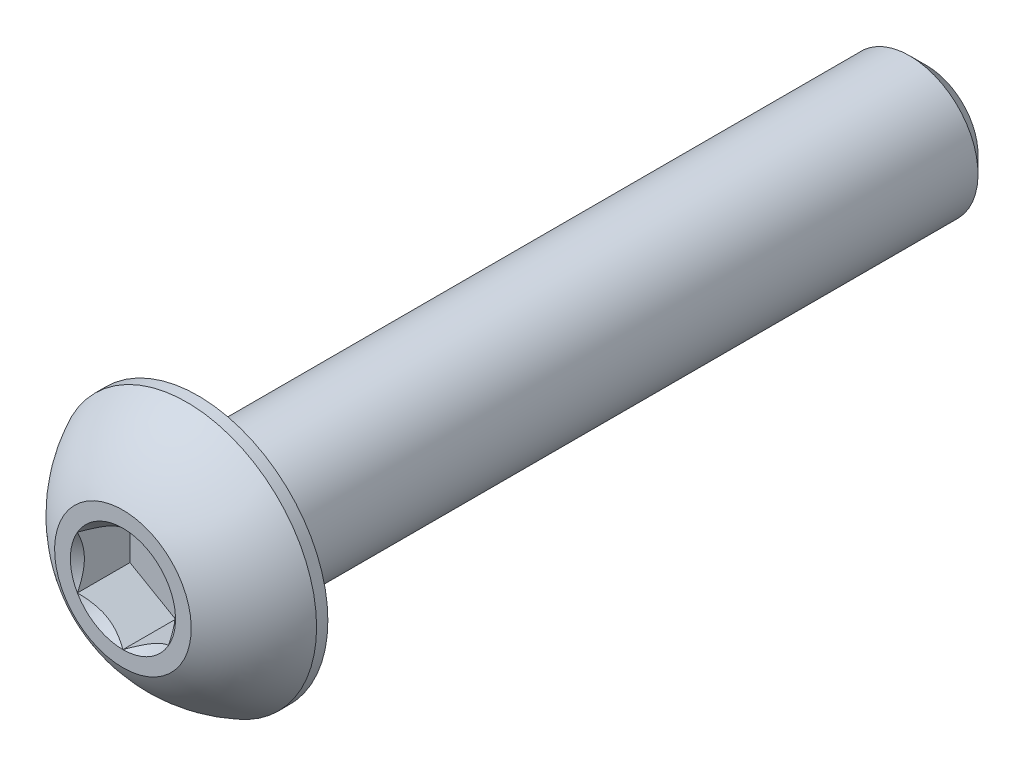
ISO-10303-21;
HEADER;
FILE_DESCRIPTION(('STEP AP214'),'2;1');
FILE_NAME('part.step','',(''),(''),'','','');
FILE_SCHEMA(('AUTOMOTIVE_DESIGN { 1 0 10303 214 1 1 1 1 }'));
ENDSEC;
DATA;
#1=APPLICATION_CONTEXT('core data for automotive mechanical design processes');
#2=APPLICATION_PROTOCOL_DEFINITION('international standard','automotive_design',2000,#1);
#3=PRODUCT_CONTEXT('',#1,'mechanical');
#4=PRODUCT('Part','Part','',(#3));
#5=PRODUCT_RELATED_PRODUCT_CATEGORY('part','',(#4));
#6=PRODUCT_DEFINITION_FORMATION('','',#4);
#7=PRODUCT_DEFINITION_CONTEXT('part definition',#1,'design');
#8=PRODUCT_DEFINITION('design','',#6,#7);
#9=PRODUCT_DEFINITION_SHAPE('','',#8);
#10=(LENGTH_UNIT() NAMED_UNIT(*) SI_UNIT(.MILLI.,.METRE.));
#11=(NAMED_UNIT(*) PLANE_ANGLE_UNIT() SI_UNIT($,.RADIAN.));
#12=(NAMED_UNIT(*) SI_UNIT($,.STERADIAN.) SOLID_ANGLE_UNIT());
#13=UNCERTAINTY_MEASURE_WITH_UNIT(LENGTH_MEASURE(1.E-05),#10,'distance_accuracy_value','');
#14=(GEOMETRIC_REPRESENTATION_CONTEXT(3) GLOBAL_UNCERTAINTY_ASSIGNED_CONTEXT((#13)) GLOBAL_UNIT_ASSIGNED_CONTEXT((#10,
#11,#12)) REPRESENTATION_CONTEXT('',''));
#15=CARTESIAN_POINT('',(0.,0.,0.));
#16=DIRECTION('',(0.,0.,1.));
#17=DIRECTION('',(1.,0.,0.));
#18=AXIS2_PLACEMENT_3D('',#15,#16,#17);
#19=CARTESIAN_POINT('',(-2.86,-2.85,-1.65));
#20=DIRECTION('',(0.,0.,-1.));
#21=DIRECTION('',(0.,1.,0.));
#22=AXIS2_PLACEMENT_3D('',#19,#20,#21);
#23=PLANE('',#22);
#24=CARTESIAN_POINT('',(0.,0.,-1.65));
#25=DIRECTION('',(0.,0.,1.));
#26=DIRECTION('',(1.,0.,0.));
#27=AXIS2_PLACEMENT_3D('',#24,#25,#26);
#28=CIRCLE('',#27,2.85);
#29=CARTESIAN_POINT('',(2.85,0.,-1.65));
#30=VERTEX_POINT('',#29);
#31=EDGE_CURVE('E369',#30,#30,#28,.T.);
#32=ORIENTED_EDGE('',*,*,#31,.F.);
#33=EDGE_LOOP('',(#32));
#34=FACE_BOUND('',#33,.T.);
#35=ADVANCED_FACE('F43',(#34),#23,.T.);
#36=CARTESIAN_POINT('',(1.,-0.577350269189626,-1.155));
#37=DIRECTION('',(0.,0.,1.));
#38=DIRECTION('',(1.,0.,0.));
#39=AXIS2_PLACEMENT_3D('',#36,#37,#38);
#40=PLANE('',#39);
#41=DIRECTION('',(0.866025403784438,0.5,0.));
#42=VECTOR('',#41,1.);
#43=CARTESIAN_POINT('',(0.,-1.15470053837925,-1.155));
#44=LINE('',#43,#42);
#45=CARTESIAN_POINT('',(0.,-1.15470053837925,-1.155));
#46=VERTEX_POINT('',#45);
#47=CARTESIAN_POINT('',(1.,-0.577350269189626,-1.155));
#48=VERTEX_POINT('',#47);
#49=EDGE_CURVE('E109',#46,#48,#44,.T.);
#50=ORIENTED_EDGE('',*,*,#49,.T.);
#51=DIRECTION('',(0.,1.,0.));
#52=VECTOR('',#51,1.);
#53=CARTESIAN_POINT('',(1.,-0.577350269189626,-1.155));
#54=LINE('',#53,#52);
#55=CARTESIAN_POINT('',(1.,0.577350269189626,-1.155));
#56=VERTEX_POINT('',#55);
#57=EDGE_CURVE('E166',#48,#56,#54,.T.);
#58=ORIENTED_EDGE('',*,*,#57,.T.);
#59=DIRECTION('',(-0.866025403784439,0.5,0.));
#60=VECTOR('',#59,1.);
#61=CARTESIAN_POINT('',(1.,0.577350269189626,-1.155));
#62=LINE('',#61,#60);
#63=CARTESIAN_POINT('',(0.,1.15470053837925,-1.155));
#64=VERTEX_POINT('',#63);
#65=EDGE_CURVE('E146',#56,#64,#62,.T.);
#66=ORIENTED_EDGE('',*,*,#65,.T.);
#67=DIRECTION('',(-0.866025403784438,-0.5,0.));
#68=VECTOR('',#67,1.);
#69=CARTESIAN_POINT('',(0.,1.15470053837925,-1.155));
#70=LINE('',#69,#68);
#71=CARTESIAN_POINT('',(-1.,0.577350269189626,-1.155));
#72=VERTEX_POINT('',#71);
#73=EDGE_CURVE('E162',#64,#72,#70,.T.);
#74=ORIENTED_EDGE('',*,*,#73,.T.);
#75=DIRECTION('',(0.,-1.,0.));
#76=VECTOR('',#75,1.);
#77=CARTESIAN_POINT('',(-1.,0.577350269189626,-1.155));
#78=LINE('',#77,#76);
#79=CARTESIAN_POINT('',(-1.,-0.577350269189626,-1.155));
#80=VERTEX_POINT('',#79);
#81=EDGE_CURVE('E159',#72,#80,#78,.T.);
#82=ORIENTED_EDGE('',*,*,#81,.T.);
#83=DIRECTION('',(0.866025403784439,-0.5,0.));
#84=VECTOR('',#83,1.);
#85=CARTESIAN_POINT('',(-1.,-0.577350269189626,-1.155));
#86=LINE('',#85,#84);
#87=EDGE_CURVE('E150',#80,#46,#86,.T.);
#88=ORIENTED_EDGE('',*,*,#87,.T.);
#89=EDGE_LOOP('',(#50,#58,#66,#74,#82,#88));
#90=FACE_BOUND('',#89,.T.);
#91=ADVANCED_FACE('F185',(#90),#40,.T.);
#92=CARTESIAN_POINT('',(-1.,-0.577350269189626,-1.155));
#93=DIRECTION('',(-0.5,-0.866025403784439,0.));
#94=DIRECTION('',(0.866025403784439,-0.5,0.));
#95=AXIS2_PLACEMENT_3D('',#92,#93,#94);
#96=PLANE('',#95);
#97=DIRECTION('',(0.,0.,1.));
#98=VECTOR('',#97,1.);
#99=CARTESIAN_POINT('',(-1.,-0.577350269189626,-1.155));
#100=LINE('',#99,#98);
#101=CARTESIAN_POINT('',(-1.,-0.577350269189626,0.));
#102=VERTEX_POINT('',#101);
#103=EDGE_CURVE('E116',#80,#102,#100,.T.);
#104=ORIENTED_EDGE('',*,*,#103,.T.);
#105=CARTESIAN_POINT('',(-1.0002,-0.577234799135788,0.000115487372614006));
#106=CARTESIAN_POINT('',(-0.965817404992819,-0.597085599618622,-0.0197220691742671));
#107=CARTESIAN_POINT('',(-0.930859881860175,-0.617268335009457,-0.0383949793611112));
#108=CARTESIAN_POINT('',(-0.859577197043911,-0.658423412276686,-0.072585257276842));
#109=CARTESIAN_POINT('',(-0.823245249471016,-0.67939967198808,-0.0880835909765412));
#110=CARTESIAN_POINT('',(-0.749983386196689,-0.721697428470847,-0.114632692857735));
#111=CARTESIAN_POINT('',(-0.713072148554586,-0.743008141459637,-0.125750226003074));
#112=CARTESIAN_POINT('',(-0.638437270689141,-0.786098608286186,-0.142880134223818));
#113=CARTESIAN_POINT('',(-0.600715911891365,-0.807877044942281,-0.148905302533327));
#114=CARTESIAN_POINT('',(-0.535707801582067,-0.845409494928863,-0.154339445032506));
#115=CARTESIAN_POINT('',(-0.508505628471828,-0.861114676896602,-0.155143061683268));
#116=CARTESIAN_POINT('',(-0.454153959330888,-0.892494627706029,-0.153793300583113));
#117=CARTESIAN_POINT('',(-0.427004476245125,-0.908169389073954,-0.151639270452801));
#118=CARTESIAN_POINT('',(-0.34594372267304,-0.954969836969511,-0.140883027871529));
#119=CARTESIAN_POINT('',(-0.292435859021573,-0.985862616452447,-0.127985443584644));
#120=CARTESIAN_POINT('',(-0.198523934856569,-1.04008269114923,-0.0968592693978226));
#121=CARTESIAN_POINT('',(-0.157679476328166,-1.06366425027551,-0.0802622022981606));
#122=CARTESIAN_POINT('',(-0.0775903626180563,-1.1099037216352,-0.0428750753147073));
#123=CARTESIAN_POINT('',(-0.0383409891295622,-1.1325643579843,-0.0220986581825968));
#124=CARTESIAN_POINT('',(0.000199999999999995,-1.15481600843309,0.000115487372613952));
#125=B_SPLINE_CURVE_WITH_KNOTS('',3,(#105,#106,#107,#108,#109,#110,#111,#112,#113,#114,#115,
#116,#117,#118,#119,#120,#121,#122,#123,#124),.UNSPECIFIED.,.F.,.F.,(4,2,2,2,2,2,2,2,2,4),(0.,
0.133237676828559,0.26725222983449,0.3991370762693,0.530689603280768,0.624814864263846,
0.718960890149132,0.907306626112097,1.05710100361789,1.20641411519286),.UNSPECIFIED.);
#126=CARTESIAN_POINT('',(0.,-1.15470053837925,0.));
#127=VERTEX_POINT('',#126);
#128=EDGE_CURVE('E101',#102,#127,#125,.T.);
#129=ORIENTED_EDGE('',*,*,#128,.T.);
#130=DIRECTION('',(0.,0.,1.));
#131=VECTOR('',#130,1.);
#132=CARTESIAN_POINT('',(0.,-1.15470053837925,-1.155));
#133=LINE('',#132,#131);
#134=EDGE_CURVE('E115',#46,#127,#133,.T.);
#135=ORIENTED_EDGE('',*,*,#134,.F.);
#136=ORIENTED_EDGE('',*,*,#87,.F.);
#137=EDGE_LOOP('',(#104,#129,#135,#136));
#138=FACE_BOUND('',#137,.T.);
#139=ADVANCED_FACE('F113',(#138),#96,.F.);
#140=CARTESIAN_POINT('',(0.,-1.15470053837925,-1.155));
#141=DIRECTION('',(0.5,-0.866025403784438,0.));
#142=DIRECTION('',(0.866025403784438,0.5,0.));
#143=AXIS2_PLACEMENT_3D('',#140,#141,#142);
#144=PLANE('',#143);
#145=ORIENTED_EDGE('',*,*,#134,.T.);
#146=CARTESIAN_POINT('',(-0.000200000000000057,-1.15481600843309,0.000115487372614094));
#147=CARTESIAN_POINT('',(0.0341825950071806,-1.13496520795026,-0.019722069174267));
#148=CARTESIAN_POINT('',(0.0691401181398248,-1.11478247255942,-0.0383949793611112));
#149=CARTESIAN_POINT('',(0.14042280295609,-1.07362739529219,-0.0725852572768421));
#150=CARTESIAN_POINT('',(0.176754750528984,-1.0526511355808,-0.0880835909765414));
#151=CARTESIAN_POINT('',(0.250016613803311,-1.01035337909803,-0.114632692857735));
#152=CARTESIAN_POINT('',(0.286927851445414,-0.989042666109241,-0.125750226003074));
#153=CARTESIAN_POINT('',(0.361562729310859,-0.945952199282691,-0.142880134223818));
#154=CARTESIAN_POINT('',(0.399284088108636,-0.924173762626596,-0.148905302533327));
#155=CARTESIAN_POINT('',(0.464292198417934,-0.886641312640014,-0.154339445032507));
#156=CARTESIAN_POINT('',(0.491494371528173,-0.870936130672275,-0.155143061683268));
#157=CARTESIAN_POINT('',(0.545846040669112,-0.839556179862848,-0.153793300583113));
#158=CARTESIAN_POINT('',(0.572995523754876,-0.823881418494923,-0.151639270452801));
#159=CARTESIAN_POINT('',(0.65405627732696,-0.777080970599366,-0.140883027871529));
#160=CARTESIAN_POINT('',(0.707564140978428,-0.74618819111643,-0.127985443584644));
#161=CARTESIAN_POINT('',(0.801476065143432,-0.691968116419649,-0.0968592693978231));
#162=CARTESIAN_POINT('',(0.842320523671834,-0.668386557293371,-0.080262202298161));
#163=CARTESIAN_POINT('',(0.922409637381944,-0.622147085933681,-0.0428750753147077));
#164=CARTESIAN_POINT('',(0.961659010870438,-0.599486449584575,-0.0220986581825972));
#165=CARTESIAN_POINT('',(1.0002,-0.577234799135788,0.000115487372613412));
#166=B_SPLINE_CURVE_WITH_KNOTS('',3,(#146,#147,#148,#149,#150,#151,#152,#153,#154,#155,#156,
#157,#158,#159,#160,#161,#162,#163,#164,#165),.UNSPECIFIED.,.F.,.F.,(4,2,2,2,2,2,2,2,2,4),(0.,
0.133237676828559,0.26725222983449,0.399137076269301,0.530689603280769,0.624814864263847,
0.718960890149134,0.907306626112098,1.05710100361789,1.20641411519286),.UNSPECIFIED.);
#167=CARTESIAN_POINT('',(1.,-0.577350269189626,0.));
#168=VERTEX_POINT('',#167);
#169=EDGE_CURVE('E106',#127,#168,#166,.T.);
#170=ORIENTED_EDGE('',*,*,#169,.T.);
#171=DIRECTION('',(0.,0.,1.));
#172=VECTOR('',#171,1.);
#173=CARTESIAN_POINT('',(1.,-0.577350269189626,-1.155));
#174=LINE('',#173,#172);
#175=EDGE_CURVE('E64',#48,#168,#174,.T.);
#176=ORIENTED_EDGE('',*,*,#175,.F.);
#177=ORIENTED_EDGE('',*,*,#49,.F.);
#178=EDGE_LOOP('',(#145,#170,#176,#177));
#179=FACE_BOUND('',#178,.T.);
#180=ADVANCED_FACE('F119',(#179),#144,.F.);
#181=CARTESIAN_POINT('',(1.,-0.577350269189626,-1.155));
#182=DIRECTION('',(1.,0.,0.));
#183=DIRECTION('',(0.,0.,-1.));
#184=AXIS2_PLACEMENT_3D('',#181,#182,#183);
#185=PLANE('',#184);
#186=ORIENTED_EDGE('',*,*,#175,.T.);
#187=CARTESIAN_POINT('',(1.,-1.15147208646462,0.370385677513861));
#188=CARTESIAN_POINT('',(1.,-1.12343447988552,0.349219919873711));
#189=CARTESIAN_POINT('',(1.,-1.09524064850697,0.328261692175909));
#190=CARTESIAN_POINT('',(1.,-1.03847715644376,0.286846022235621));
#191=CARTESIAN_POINT('',(1.,-1.00990740382975,0.266388706123658));
#192=CARTESIAN_POINT('',(1.,-0.923120894333477,0.205604794954508));
#193=CARTESIAN_POINT('',(1.,-0.864253173759059,0.166192228961397));
#194=CARTESIAN_POINT('',(1.,-0.740809858258045,0.0888206642002043));
#195=CARTESIAN_POINT('',(1.,-0.676100255137807,0.0510730391143415));
#196=CARTESIAN_POINT('',(1.,-0.543448939049124,-0.0179754124487089));
#197=CARTESIAN_POINT('',(1.,-0.475519112027779,-0.0492979721531354));
#198=CARTESIAN_POINT('',(1.,-0.373555850333529,-0.0876182211162059));
#199=CARTESIAN_POINT('',(1.,-0.341031989670907,-0.0986164083578445));
#200=CARTESIAN_POINT('',(1.,-0.275199079052293,-0.11800165785264));
#201=CARTESIAN_POINT('',(1.,-0.241889975173933,-0.126388540223302));
#202=CARTESIAN_POINT('',(1.,-0.175247517042992,-0.139974779280984));
#203=CARTESIAN_POINT('',(1.,-0.141925568218175,-0.145229209232033));
#204=CARTESIAN_POINT('',(1.,-0.0749144362322789,-0.152451313429109));
#205=CARTESIAN_POINT('',(1.,-0.0412251978501617,-0.154418486389493));
#206=CARTESIAN_POINT('',(1.,0.0249580992634211,-0.15491680160684));
#207=CARTESIAN_POINT('',(1.,0.0574512826460394,-0.153569732111366));
#208=CARTESIAN_POINT('',(1.,0.122148505701867,-0.147783515501016));
#209=CARTESIAN_POINT('',(1.,0.154352610132927,-0.143345079338465));
#210=CARTESIAN_POINT('',(1.,0.21879989886764,-0.131543169854797));
#211=CARTESIAN_POINT('',(1.,0.251033743268954,-0.124129458961492));
#212=CARTESIAN_POINT('',(1.,0.314797132354919,-0.106771057501325));
#213=CARTESIAN_POINT('',(1.,0.346326735731005,-0.096826578711171));
#214=CARTESIAN_POINT('',(1.,0.445594187730205,-0.061776517445664));
#215=CARTESIAN_POINT('',(1.,0.511919139476036,-0.0326791416432762));
#216=CARTESIAN_POINT('',(1.,0.641453244657532,0.032015329686504));
#217=CARTESIAN_POINT('',(1.,0.704650133126344,0.0676357767152409));
#218=CARTESIAN_POINT('',(1.,0.825428490174987,0.141123901346934));
#219=CARTESIAN_POINT('',(1.,0.883132947867685,0.178791947135462));
#220=CARTESIAN_POINT('',(1.,0.968148853704565,0.237022852943162));
#221=CARTESIAN_POINT('',(1.,0.996120570380285,0.256638475762855));
#222=CARTESIAN_POINT('',(1.,1.05168177729901,0.29638851706127));
#223=CARTESIAN_POINT('',(1.,1.079271369977,0.316522792198831));
#224=CARTESIAN_POINT('',(1.,1.10670185346329,0.336872119072971));
#225=B_SPLINE_CURVE_WITH_KNOTS('',3,(#187,#188,#189,#190,#191,#192,#193,#194,#195,#196,#197,
#198,#199,#200,#201,#202,#203,#204,#205,#206,#207,#208,#209,#210,#211,#212,#213,#214,#215,#216,
#217,#218,#219,#220,#221,#222,#223,#224),.UNSPECIFIED.,.F.,.F.,(4,2,2,2,2,2,2,2,2,2,2,2,2,2,2,2,
2,2,4),(0.,0.105386459083291,0.210799187330125,0.423233611565469,0.647793540908503,
0.87158087773861,0.974493074181421,1.07741235827201,1.17846428203205,1.27953161415762,
1.3769408673961,1.47432772585408,1.57343322804293,1.67253043972851,1.88917353996827,
2.10660791038813,2.31323734249843,2.41572589232045,2.51818641476503),.UNSPECIFIED.);
#226=CARTESIAN_POINT('',(1.,0.577350269189626,0.));
#227=VERTEX_POINT('',#226);
#228=EDGE_CURVE('E132',#168,#227,#225,.T.);
#229=ORIENTED_EDGE('',*,*,#228,.T.);
#230=DIRECTION('',(0.,0.,1.));
#231=VECTOR('',#230,1.);
#232=CARTESIAN_POINT('',(1.,0.577350269189626,-1.155));
#233=LINE('',#232,#231);
#234=EDGE_CURVE('E136',#56,#227,#233,.T.);
#235=ORIENTED_EDGE('',*,*,#234,.F.);
#236=ORIENTED_EDGE('',*,*,#57,.F.);
#237=EDGE_LOOP('',(#186,#229,#235,#236));
#238=FACE_BOUND('',#237,.T.);
#239=ADVANCED_FACE('F135',(#238),#185,.F.);
#240=CARTESIAN_POINT('',(1.,0.577350269189626,-1.155));
#241=DIRECTION('',(0.5,0.866025403784439,0.));
#242=DIRECTION('',(-0.866025403784439,0.5,0.));
#243=AXIS2_PLACEMENT_3D('',#240,#241,#242);
#244=PLANE('',#243);
#245=ORIENTED_EDGE('',*,*,#234,.T.);
#246=CARTESIAN_POINT('',(1.0002,0.577234799135788,0.00011548737261379));
#247=CARTESIAN_POINT('',(0.965817404992819,0.597085599618622,-0.0197220691742671));
#248=CARTESIAN_POINT('',(0.930859881860175,0.617268335009456,-0.0383949793611112));
#249=CARTESIAN_POINT('',(0.85957719704391,0.658423412276686,-0.0725852572768423));
#250=CARTESIAN_POINT('',(0.823245249471016,0.67939967198808,-0.0880835909765417));
#251=CARTESIAN_POINT('',(0.749983386196689,0.721697428470847,-0.114632692857735));
#252=CARTESIAN_POINT('',(0.713072148554586,0.743008141459637,-0.125750226003074));
#253=CARTESIAN_POINT('',(0.638437270689141,0.786098608286186,-0.142880134223818));
#254=CARTESIAN_POINT('',(0.600715911891364,0.807877044942281,-0.148905302533328));
#255=CARTESIAN_POINT('',(0.535707801582067,0.845409494928863,-0.154339445032507));
#256=CARTESIAN_POINT('',(0.508505628471828,0.861114676896602,-0.155143061683268));
#257=CARTESIAN_POINT('',(0.454153959330888,0.892494627706029,-0.153793300583113));
#258=CARTESIAN_POINT('',(0.427004476245124,0.908169389073954,-0.151639270452801));
#259=CARTESIAN_POINT('',(0.34594372267304,0.954969836969511,-0.140883027871529));
#260=CARTESIAN_POINT('',(0.292435859021573,0.985862616452447,-0.127985443584644));
#261=CARTESIAN_POINT('',(0.198523934856568,1.04008269114923,-0.0968592693978228));
#262=CARTESIAN_POINT('',(0.157679476328165,1.06366425027551,-0.0802622022981607));
#263=CARTESIAN_POINT('',(0.0775903626180559,1.1099037216352,-0.0428750753147073));
#264=CARTESIAN_POINT('',(0.0383409891295617,1.1325643579843,-0.0220986581825967));
#265=CARTESIAN_POINT('',(-0.000200000000000544,1.15481600843309,0.000115487372614062));
#266=B_SPLINE_CURVE_WITH_KNOTS('',3,(#246,#247,#248,#249,#250,#251,#252,#253,#254,#255,#256,
#257,#258,#259,#260,#261,#262,#263,#264,#265),.UNSPECIFIED.,.F.,.F.,(4,2,2,2,2,2,2,2,2,4),(0.,
0.133237676828559,0.26725222983449,0.3991370762693,0.530689603280768,0.624814864263846,
0.718960890149133,0.907306626112097,1.05710100361789,1.20641411519286),.UNSPECIFIED.);
#267=CARTESIAN_POINT('',(0.,1.15470053837925,0.));
#268=VERTEX_POINT('',#267);
#269=EDGE_CURVE('E143',#227,#268,#266,.T.);
#270=ORIENTED_EDGE('',*,*,#269,.T.);
#271=DIRECTION('',(0.,0.,1.));
#272=VECTOR('',#271,1.);
#273=CARTESIAN_POINT('',(0.,1.15470053837925,-1.155));
#274=LINE('',#273,#272);
#275=EDGE_CURVE('E148',#64,#268,#274,.T.);
#276=ORIENTED_EDGE('',*,*,#275,.F.);
#277=ORIENTED_EDGE('',*,*,#65,.F.);
#278=EDGE_LOOP('',(#245,#270,#276,#277));
#279=FACE_BOUND('',#278,.T.);
#280=ADVANCED_FACE('F142',(#279),#244,.F.);
#281=CARTESIAN_POINT('',(0.,1.15470053837925,-1.155));
#282=DIRECTION('',(-0.5,0.866025403784439,0.));
#283=DIRECTION('',(-0.866025403784439,-0.5,0.));
#284=AXIS2_PLACEMENT_3D('',#281,#282,#283);
#285=PLANE('',#284);
#286=ORIENTED_EDGE('',*,*,#275,.T.);
#287=CARTESIAN_POINT('',(0.000199999999999519,1.15481600843309,0.000115487372613877));
#288=CARTESIAN_POINT('',(-0.0341825950071811,1.13496520795026,-0.0197220691742673));
#289=CARTESIAN_POINT('',(-0.0691401181398252,1.11478247255942,-0.0383949793611114));
#290=CARTESIAN_POINT('',(-0.14042280295609,1.07362739529219,-0.0725852572768421));
#291=CARTESIAN_POINT('',(-0.176754750528985,1.0526511355808,-0.0880835909765413));
#292=CARTESIAN_POINT('',(-0.250016613803312,1.01035337909803,-0.114632692857735));
#293=CARTESIAN_POINT('',(-0.286927851445415,0.989042666109241,-0.125750226003074));
#294=CARTESIAN_POINT('',(-0.361562729310859,0.945952199282691,-0.142880134223818));
#295=CARTESIAN_POINT('',(-0.399284088108636,0.924173762626597,-0.148905302533328));
#296=CARTESIAN_POINT('',(-0.464292198417934,0.886641312640015,-0.154339445032506));
#297=CARTESIAN_POINT('',(-0.491494371528172,0.870936130672276,-0.155143061683268));
#298=CARTESIAN_POINT('',(-0.545846040669112,0.839556179862849,-0.153793300583113));
#299=CARTESIAN_POINT('',(-0.572995523754876,0.823881418494924,-0.151639270452801));
#300=CARTESIAN_POINT('',(-0.65405627732696,0.777080970599367,-0.140883027871529));
#301=CARTESIAN_POINT('',(-0.707564140978428,0.74618819111643,-0.127985443584644));
#302=CARTESIAN_POINT('',(-0.801476065143432,0.69196811641965,-0.0968592693978229));
#303=CARTESIAN_POINT('',(-0.842320523671834,0.668386557293372,-0.0802622022981609));
#304=CARTESIAN_POINT('',(-0.922409637381944,0.622147085933681,-0.0428750753147075));
#305=CARTESIAN_POINT('',(-0.961659010870438,0.599486449584575,-0.022098658182597));
#306=CARTESIAN_POINT('',(-1.0002,0.577234799135788,0.000115487372613569));
#307=B_SPLINE_CURVE_WITH_KNOTS('',3,(#287,#288,#289,#290,#291,#292,#293,#294,#295,#296,#297,
#298,#299,#300,#301,#302,#303,#304,#305,#306),.UNSPECIFIED.,.F.,.F.,(4,2,2,2,2,2,2,2,2,4),(0.,
0.133237676828559,0.26725222983449,0.3991370762693,0.530689603280768,0.624814864263846,
0.718960890149133,0.907306626112097,1.05710100361789,1.20641411519286),.UNSPECIFIED.);
#308=CARTESIAN_POINT('',(-1.,0.577350269189626,0.));
#309=VERTEX_POINT('',#308);
#310=EDGE_CURVE('E202',#268,#309,#307,.T.);
#311=ORIENTED_EDGE('',*,*,#310,.T.);
#312=DIRECTION('',(0.,0.,1.));
#313=VECTOR('',#312,1.);
#314=CARTESIAN_POINT('',(-1.,0.577350269189626,-1.155));
#315=LINE('',#314,#313);
#316=EDGE_CURVE('E152',#72,#309,#315,.T.);
#317=ORIENTED_EDGE('',*,*,#316,.F.);
#318=ORIENTED_EDGE('',*,*,#73,.F.);
#319=EDGE_LOOP('',(#286,#311,#317,#318));
#320=FACE_BOUND('',#319,.T.);
#321=ADVANCED_FACE('F216',(#320),#285,.F.);
#322=CARTESIAN_POINT('',(-1.,0.577350269189626,-1.155));
#323=DIRECTION('',(-1.,0.,0.));
#324=DIRECTION('',(0.,0.,1.));
#325=AXIS2_PLACEMENT_3D('',#322,#323,#324);
#326=PLANE('',#325);
#327=ORIENTED_EDGE('',*,*,#316,.T.);
#328=CARTESIAN_POINT('',(-1.,-1.15147208646462,0.370385677513862));
#329=CARTESIAN_POINT('',(-1.,-1.12343447988552,0.349219919873712));
#330=CARTESIAN_POINT('',(-1.,-1.09524064850697,0.32826169217591));
#331=CARTESIAN_POINT('',(-1.,-1.03847715644376,0.286846022235621));
#332=CARTESIAN_POINT('',(-1.,-1.00990740382975,0.266388706123658));
#333=CARTESIAN_POINT('',(-1.,-0.923120894333477,0.205604794954509));
#334=CARTESIAN_POINT('',(-1.,-0.86425317375906,0.166192228961397));
#335=CARTESIAN_POINT('',(-1.,-0.740809858258046,0.0888206642002046));
#336=CARTESIAN_POINT('',(-1.,-0.676100255137807,0.0510730391143418));
#337=CARTESIAN_POINT('',(-1.,-0.543448939049125,-0.0179754124487087));
#338=CARTESIAN_POINT('',(-1.,-0.475519112027779,-0.0492979721531352));
#339=CARTESIAN_POINT('',(-1.,-0.373555850333529,-0.0876182211162056));
#340=CARTESIAN_POINT('',(-1.,-0.341031989670908,-0.0986164083578442));
#341=CARTESIAN_POINT('',(-1.,-0.275199079052293,-0.11800165785264));
#342=CARTESIAN_POINT('',(-1.,-0.241889975173933,-0.126388540223301));
#343=CARTESIAN_POINT('',(-1.,-0.175247517042993,-0.139974779280984));
#344=CARTESIAN_POINT('',(-1.,-0.141925568218175,-0.145229209232033));
#345=CARTESIAN_POINT('',(-1.,-0.0749144362322791,-0.152451313429108));
#346=CARTESIAN_POINT('',(-1.,-0.0412251978501619,-0.154418486389493));
#347=CARTESIAN_POINT('',(-1.,0.0249580992634209,-0.15491680160684));
#348=CARTESIAN_POINT('',(-1.,0.0574512826460392,-0.153569732111367));
#349=CARTESIAN_POINT('',(-1.,0.122148505701867,-0.147783515501016));
#350=CARTESIAN_POINT('',(-1.,0.154352610132926,-0.143345079338465));
#351=CARTESIAN_POINT('',(-1.,0.21879989886764,-0.131543169854797));
#352=CARTESIAN_POINT('',(-1.,0.251033743268954,-0.124129458961492));
#353=CARTESIAN_POINT('',(-1.,0.314797132354919,-0.106771057501325));
#354=CARTESIAN_POINT('',(-1.,0.346326735731004,-0.0968265787111711));
#355=CARTESIAN_POINT('',(-1.,0.445594187730205,-0.0617765174456643));
#356=CARTESIAN_POINT('',(-1.,0.511919139476036,-0.0326791416432766));
#357=CARTESIAN_POINT('',(-1.,0.641453244657532,0.0320153296865037));
#358=CARTESIAN_POINT('',(-1.,0.704650133126344,0.0676357767152406));
#359=CARTESIAN_POINT('',(-1.,0.825428490174986,0.141123901346934));
#360=CARTESIAN_POINT('',(-1.,0.883132947867684,0.178791947135462));
#361=CARTESIAN_POINT('',(-1.,0.968148853704565,0.237022852943162));
#362=CARTESIAN_POINT('',(-1.,0.996120570380285,0.256638475762855));
#363=CARTESIAN_POINT('',(-1.,1.05168177729901,0.29638851706127));
#364=CARTESIAN_POINT('',(-1.,1.079271369977,0.316522792198831));
#365=CARTESIAN_POINT('',(-1.,1.10670185346329,0.33687211907297));
#366=B_SPLINE_CURVE_WITH_KNOTS('',3,(#328,#329,#330,#331,#332,#333,#334,#335,#336,#337,#338,
#339,#340,#341,#342,#343,#344,#345,#346,#347,#348,#349,#350,#351,#352,#353,#354,#355,#356,#357,
#358,#359,#360,#361,#362,#363,#364,#365),.UNSPECIFIED.,.F.,.F.,(4,2,2,2,2,2,2,2,2,2,2,2,2,2,2,2,
2,2,4),(0.,0.105386459083291,0.210799187330125,0.423233611565469,0.647793540908504,
0.87158087773861,0.974493074181421,1.07741235827201,1.17846428203205,1.27953161415762,
1.3769408673961,1.47432772585408,1.57343322804293,1.67253043972851,1.88917353996827,
2.10660791038813,2.31323734249843,2.41572589232045,2.51818641476503),.UNSPECIFIED.);
#367=EDGE_CURVE('E117',#309,#102,#366,.F.);
#368=ORIENTED_EDGE('',*,*,#367,.T.);
#369=ORIENTED_EDGE('',*,*,#103,.F.);
#370=ORIENTED_EDGE('',*,*,#81,.F.);
#371=EDGE_LOOP('',(#327,#368,#369,#370));
#372=FACE_BOUND('',#371,.T.);
#373=ADVANCED_FACE('F213',(#372),#326,.F.);
#374=CARTESIAN_POINT('',(0.,0.,0.));
#375=DIRECTION('',(0.,0.,1.));
#376=DIRECTION('',(1.,0.,0.));
#377=AXIS2_PLACEMENT_3D('',#374,#375,#376);
#378=CONICAL_SURFACE('',#377,1.15470053837925,0.78539816339745);
#379=CARTESIAN_POINT('',(0.,0.,0.));
#380=DIRECTION('',(0.,0.,1.));
#381=DIRECTION('',(1.,0.,0.));
#382=AXIS2_PLACEMENT_3D('',#379,#380,#381);
#383=CIRCLE('',#382,1.15470053837925);
#384=EDGE_CURVE('E98',#102,#127,#383,.T.);
#385=ORIENTED_EDGE('',*,*,#384,.T.);
#386=ORIENTED_EDGE('',*,*,#128,.F.);
#387=EDGE_LOOP('',(#385,#386));
#388=FACE_BOUND('',#387,.T.);
#389=ADVANCED_FACE('F99',(#388),#378,.F.);
#390=EDGE_CURVE('E51',#127,#168,#383,.T.);
#391=ORIENTED_EDGE('',*,*,#390,.T.);
#392=ORIENTED_EDGE('',*,*,#169,.F.);
#393=EDGE_LOOP('',(#391,#392));
#394=FACE_BOUND('',#393,.T.);
#395=ADVANCED_FACE('F107',(#394),#378,.F.);
#396=EDGE_CURVE('E12',#168,#227,#383,.T.);
#397=ORIENTED_EDGE('',*,*,#396,.T.);
#398=ORIENTED_EDGE('',*,*,#228,.F.);
#399=EDGE_LOOP('',(#397,#398));
#400=FACE_BOUND('',#399,.T.);
#401=ADVANCED_FACE('F131',(#400),#378,.F.);
#402=EDGE_CURVE('E46',#227,#268,#383,.T.);
#403=ORIENTED_EDGE('',*,*,#402,.T.);
#404=ORIENTED_EDGE('',*,*,#269,.F.);
#405=EDGE_LOOP('',(#403,#404));
#406=FACE_BOUND('',#405,.T.);
#407=ADVANCED_FACE('F315',(#406),#378,.F.);
#408=EDGE_CURVE('E240',#268,#309,#383,.T.);
#409=ORIENTED_EDGE('',*,*,#408,.T.);
#410=ORIENTED_EDGE('',*,*,#310,.F.);
#411=EDGE_LOOP('',(#409,#410));
#412=FACE_BOUND('',#411,.T.);
#413=ADVANCED_FACE('F241',(#412),#378,.F.);
#414=EDGE_CURVE('E105',#309,#102,#383,.T.);
#415=ORIENTED_EDGE('',*,*,#414,.T.);
#416=ORIENTED_EDGE('',*,*,#367,.F.);
#417=EDGE_LOOP('',(#415,#416));
#418=FACE_BOUND('',#417,.T.);
#419=ADVANCED_FACE('F237',(#418),#378,.F.);
#420=CARTESIAN_POINT('',(0.,-1.5,0.));
#421=DIRECTION('',(0.,0.,-1.));
#422=DIRECTION('',(-1.,0.,0.));
#423=AXIS2_PLACEMENT_3D('',#420,#421,#422);
#424=PLANE('',#423);
#425=ORIENTED_EDGE('',*,*,#414,.F.);
#426=ORIENTED_EDGE('',*,*,#408,.F.);
#427=ORIENTED_EDGE('',*,*,#402,.F.);
#428=ORIENTED_EDGE('',*,*,#396,.F.);
#429=ORIENTED_EDGE('',*,*,#390,.F.);
#430=ORIENTED_EDGE('',*,*,#384,.F.);
#431=EDGE_LOOP('',(#425,#426,#427,#428,#429,#430));
#432=FACE_BOUND('',#431,.T.);
#433=CARTESIAN_POINT('',(0.,0.,0.));
#434=DIRECTION('',(0.,0.,1.));
#435=DIRECTION('',(1.,0.,0.));
#436=AXIS2_PLACEMENT_3D('',#433,#434,#435);
#437=CIRCLE('',#436,1.5);
#438=CARTESIAN_POINT('',(0.,-1.5,0.));
#439=VERTEX_POINT('',#438);
#440=EDGE_CURVE('E138',#439,#439,#437,.T.);
#441=ORIENTED_EDGE('',*,*,#440,.T.);
#442=EDGE_LOOP('',(#441));
#443=FACE_BOUND('',#442,.T.);
#444=ADVANCED_FACE('F125',(#432,#443),#424,.F.);
#445=CARTESIAN_POINT('',(0.,0.,-2.79483288770053));
#446=DIRECTION('',(0.,0.,1.));
#447=DIRECTION('',(0.,-1.,0.));
#448=AXIS2_PLACEMENT_3D('',#445,#446,#447);
#449=SPHERICAL_SURFACE('',#448,3.17192226735973);
#450=CARTESIAN_POINT('',(0.,0.,-1.4025));
#451=DIRECTION('',(0.,0.,1.));
#452=DIRECTION('',(1.,0.,0.));
#453=AXIS2_PLACEMENT_3D('',#450,#451,#452);
#454=CIRCLE('',#453,2.85);
#455=CARTESIAN_POINT('',(0.,-2.85,-1.4025));
#456=VERTEX_POINT('',#455);
#457=EDGE_CURVE('E122',#456,#456,#454,.T.);
#458=CARTESIAN_POINT('',(0.,-1.5,0.));
#459=CARTESIAN_POINT('',(0.,-1.5181600798921,-0.00974656947336491));
#460=CARTESIAN_POINT('',(0.,-1.53622513742981,-0.0196701847238471));
#461=CARTESIAN_POINT('',(0.,-1.57215840256594,-0.0398676311293115));
#462=CARTESIAN_POINT('',(0.,-1.59002661016438,-0.0501414622842937));
#463=CARTESIAN_POINT('',(0.,-1.6255593701915,-0.0710354648490232));
#464=CARTESIAN_POINT('',(0.,-1.64322392262019,-0.0816556362587706));
#465=CARTESIAN_POINT('',(0.,-1.67834266450262,-0.103238276426967));
#466=CARTESIAN_POINT('',(0.,-1.69579685395635,-0.114200745185415));
#467=CARTESIAN_POINT('',(0.,-1.73048823664554,-0.136463816635605));
#468=CARTESIAN_POINT('',(0.,-1.74772542988099,-0.147764419327346));
#469=CARTESIAN_POINT('',(0.,-1.78197627078176,-0.170699464187152));
#470=CARTESIAN_POINT('',(0.,-1.79898991844709,-0.182333906355218));
#471=CARTESIAN_POINT('',(0.,-1.83278720341135,-0.205932209546912));
#472=CARTESIAN_POINT('',(0.,-1.84957084071028,-0.217896070570539));
#473=CARTESIAN_POINT('',(0.,-1.88290172764636,-0.242148665498754));
#474=CARTESIAN_POINT('',(0.,-1.8994489772835,-0.25443739940334));
#475=CARTESIAN_POINT('',(0.,-1.93230080139369,-0.279335070725423));
#476=CARTESIAN_POINT('',(0.,-1.94860537586673,-0.291944008142919));
#477=CARTESIAN_POINT('',(0.,-1.98096565436365,-0.317477295441111));
#478=CARTESIAN_POINT('',(0.,-1.99702135838753,-0.330401645321806));
#479=CARTESIAN_POINT('',(0.,-2.02887779526296,-0.356560846652225));
#480=CARTESIAN_POINT('',(0.,-2.04467852811452,-0.369795698101948));
#481=CARTESIAN_POINT('',(0.,-2.07601901880464,-0.396570873693306));
#482=CARTESIAN_POINT('',(0.,-2.09155877664321,-0.410111197834942));
#483=CARTESIAN_POINT('',(0.,-2.12237141262985,-0.437492173862105));
#484=CARTESIAN_POINT('',(0.,-2.13764429077792,-0.451332825747632));
#485=CARTESIAN_POINT('',(0.,-2.16791736411296,-0.479309198198267));
#486=CARTESIAN_POINT('',(0.,-2.18291755929993,-0.493444918763374));
#487=CARTESIAN_POINT('',(0.,-2.21263956705415,-0.52200605739095));
#488=CARTESIAN_POINT('',(0.,-2.22736137962139,-0.536431475453418));
#489=CARTESIAN_POINT('',(0.,-2.2565210282552,-0.56556652781647));
#490=CARTESIAN_POINT('',(0.,-2.27095886432177,-0.580276162117054));
#491=CARTESIAN_POINT('',(0.,-2.2995450739765,-0.609974057702794));
#492=CARTESIAN_POINT('',(0.,-2.31369344756465,-0.62496231898795));
#493=CARTESIAN_POINT('',(0.,-2.34169535627252,-0.655211773418758));
#494=CARTESIAN_POINT('',(0.,-2.35554889139223,-0.670472966564409));
#495=CARTESIAN_POINT('',(0.,-2.38295585920366,-0.701262485885582));
#496=CARTESIAN_POINT('',(0.,-2.39650929189537,-0.716790812061104));
#497=CARTESIAN_POINT('',(0.,-2.42331090492182,-0.748108697108241));
#498=CARTESIAN_POINT('',(0.,-2.43655908525656,-0.763898255979857));
#499=CARTESIAN_POINT('',(0.,-2.46274515962755,-0.795732606824226));
#500=CARTESIAN_POINT('',(0.,-2.47568305366379,-0.811777398796979));
#501=CARTESIAN_POINT('',(0.,-2.5012436393965,-0.844116119267125));
#502=CARTESIAN_POINT('',(0.,-2.51386633109298,-0.860410047764518));
#503=CARTESIAN_POINT('',(0.,-2.53879171587278,-0.893240850042598));
#504=CARTESIAN_POINT('',(0.,-2.55109440895612,-0.909777723823285));
#505=CARTESIAN_POINT('',(0.,-2.57537512182785,-0.943088133113638));
#506=CARTESIAN_POINT('',(0.,-2.58735314161625,-0.959861668623304));
#507=CARTESIAN_POINT('',(0.,-2.61097995657956,-0.993639027894246));
#508=CARTESIAN_POINT('',(0.,-2.62262875175448,-1.01064285165552));
#509=CARTESIAN_POINT('',(0.,-2.64559269128199,-1.04487432644225));
#510=CARTESIAN_POINT('',(0.,-2.65690783563458,-1.06210197746771));
#511=CARTESIAN_POINT('',(0.,-2.67920017403639,-1.09677456077299));
#512=CARTESIAN_POINT('',(0.,-2.69017736808561,-1.11421949305282));
#513=CARTESIAN_POINT('',(0.,-2.711789634999,-1.14932001019995));
#514=CARTESIAN_POINT('',(0.,-2.72242470786316,-1.16697559506725));
#515=CARTESIAN_POINT('',(0.,-2.74334869082117,-1.20249070903943));
#516=CARTESIAN_POINT('',(0.,-2.75363760091502,-1.22035023814429));
#517=CARTESIAN_POINT('',(0.,-2.77386535089241,-1.25626645340824));
#518=CARTESIAN_POINT('',(0.,-2.78380419077596,-1.27432313956732));
#519=CARTESIAN_POINT('',(0.,-2.80332801615778,-1.31062681184411));
#520=CARTESIAN_POINT('',(0.,-2.81291300165605,-1.32887379796182));
#521=CARTESIAN_POINT('',(0.,-2.83172550494215,-1.3655511220839));
#522=CARTESIAN_POINT('',(0.,-2.84095302272998,-1.38398146008827));
#523=CARTESIAN_POINT('',(0.,-2.85,-1.4025));
#524=B_SPLINE_CURVE_WITH_KNOTS('',3,(#458,#459,#460,#461,#462,#463,#464,#465,#466,#467,#468,
#469,#470,#471,#472,#473,#474,#475,#476,#477,#478,#479,#480,#481,#482,#483,#484,#485,#486,#487,
#488,#489,#490,#491,#492,#493,#494,#495,#496,#497,#498,#499,#500,#501,#502,#503,#504,#505,#506,
#507,#508,#509,#510,#511,#512,#513,#514,#515,#516,#517,#518,#519,#520,#521,#522,#523),
.UNSPECIFIED.,.F.,.F.,(4,2,2,2,2,2,2,2,2,2,2,2,2,2,2,2,2,2,2,2,2,2,2,2,2,2,2,2,2,2,2,2,4),(0.,
0.0618298941826981,0.123659788365397,0.185489682548094,0.247319576730793,0.309149470913491,
0.37097936509619,0.432809259278888,0.494639153461587,0.556469047644284,0.618298941826983,
0.680128836009681,0.741958730192379,0.803788624375077,0.865618518557776,0.927448412740474,
0.989278306923172,1.05110820110587,1.11293809528857,1.17476798947127,1.23659788365397,
1.29842777783666,1.36025767201936,1.42208756620206,1.48391746038476,1.54574735456746,
1.60757724875015,1.66940714293285,1.73123703711555,1.79306693129825,1.85489682548095,
1.91672671966365,1.97855661384634),.UNSPECIFIED.);
#525=EDGE_CURVE('BSEAM286',#439,#456,#524,.T.);
#526=ORIENTED_EDGE('',*,*,#440,.F.);
#527=ORIENTED_EDGE('',*,*,#457,.T.);
#528=ORIENTED_EDGE('',*,*,#525,.T.);
#529=ORIENTED_EDGE('',*,*,#525,.F.);
#530=EDGE_LOOP('',(#526,#528,#527,#529));
#531=FACE_BOUND('',#530,.T.);
#532=ADVANCED_FACE('F286',(#531),#449,.T.);
#533=CARTESIAN_POINT('',(0.,0.,0.));
#534=DIRECTION('',(0.,0.,1.));
#535=DIRECTION('',(1.,0.,0.));
#536=AXIS2_PLACEMENT_3D('',#533,#534,#535);
#537=CYLINDRICAL_SURFACE('',#536,2.85);
#538=ORIENTED_EDGE('',*,*,#457,.F.);
#539=EDGE_LOOP('',(#538));
#540=FACE_BOUND('',#539,.T.);
#541=ORIENTED_EDGE('',*,*,#31,.T.);
#542=EDGE_LOOP('',(#541));
#543=FACE_BOUND('',#542,.T.);
#544=ADVANCED_FACE('F230',(#540,#543),#537,.T.);
#545=CLOSED_SHELL('',(#35,#91,#139,#180,#239,#280,#321,#373,#389,#395,#401,#407,#413,#419,#444,
#532,#544));
#546=MANIFOLD_SOLID_BREP('B2',#545);
#547=CARTESIAN_POINT('',(-2.86,-2.85,-1.65));
#548=DIRECTION('',(0.,0.,-1.));
#549=DIRECTION('',(0.,1.,0.));
#550=AXIS2_PLACEMENT_3D('',#547,#548,#549);
#551=PLANE('',#550);
#552=CARTESIAN_POINT('',(0.,0.,-1.65));
#553=DIRECTION('',(0.,0.,1.));
#554=DIRECTION('',(1.,0.,0.));
#555=AXIS2_PLACEMENT_3D('',#552,#553,#554);
#556=CIRCLE('',#555,1.5);
#557=CARTESIAN_POINT('',(1.5,0.,-1.65));
#558=VERTEX_POINT('',#557);
#559=EDGE_CURVE('E388',#558,#558,#556,.F.);
#560=ORIENTED_EDGE('',*,*,#559,.F.);
#561=EDGE_LOOP('',(#560));
#562=FACE_BOUND('',#561,.T.);
#563=ADVANCED_FACE('F377',(#562),#551,.F.);
#564=CARTESIAN_POINT('',(0.,-1.5,-17.65));
#565=DIRECTION('',(0.,0.,-1.));
#566=DIRECTION('',(0.,1.,0.));
#567=AXIS2_PLACEMENT_3D('',#564,#565,#566);
#568=PLANE('',#567);
#569=CARTESIAN_POINT('',(0.,0.,-17.65));
#570=DIRECTION('',(0.,0.,-1.));
#571=DIRECTION('',(0.,1.,0.));
#572=AXIS2_PLACEMENT_3D('',#569,#570,#571);
#573=CIRCLE('',#572,1.125);
#574=CARTESIAN_POINT('',(0.,1.125,-17.65));
#575=VERTEX_POINT('',#574);
#576=EDGE_CURVE('E384',#575,#575,#573,.T.);
#577=ORIENTED_EDGE('',*,*,#576,.T.);
#578=EDGE_LOOP('',(#577));
#579=FACE_BOUND('',#578,.T.);
#580=ADVANCED_FACE('F398',(#579),#568,.T.);
#581=CARTESIAN_POINT('',(0.,0.,-17.65));
#582=DIRECTION('',(0.,0.,-1.));
#583=DIRECTION('',(0.,1.,0.));
#584=AXIS2_PLACEMENT_3D('',#581,#582,#583);
#585=CYLINDRICAL_SURFACE('',#584,1.5);
#586=CARTESIAN_POINT('',(0.,0.,-17.275));
#587=DIRECTION('',(0.,0.,-1.));
#588=DIRECTION('',(0.,1.,0.));
#589=AXIS2_PLACEMENT_3D('',#586,#587,#588);
#590=CIRCLE('',#589,1.5);
#591=CARTESIAN_POINT('',(0.,1.5,-17.275));
#592=VERTEX_POINT('',#591);
#593=EDGE_CURVE('E42',#592,#592,#590,.F.);
#594=ORIENTED_EDGE('',*,*,#593,.T.);
#595=EDGE_LOOP('',(#594));
#596=FACE_BOUND('',#595,.T.);
#597=ORIENTED_EDGE('',*,*,#559,.T.);
#598=EDGE_LOOP('',(#597));
#599=FACE_BOUND('',#598,.T.);
#600=ADVANCED_FACE('F395',(#596,#599),#585,.T.);
#601=CARTESIAN_POINT('',(0.,0.,-17.65));
#602=DIRECTION('',(0.,0.,1.));
#603=DIRECTION('',(0.,-1.,0.));
#604=AXIS2_PLACEMENT_3D('',#601,#602,#603);
#605=CONICAL_SURFACE('',#604,1.125,0.785398163397446);
#606=ORIENTED_EDGE('',*,*,#593,.F.);
#607=EDGE_LOOP('',(#606));
#608=FACE_BOUND('',#607,.T.);
#609=ORIENTED_EDGE('',*,*,#576,.F.);
#610=EDGE_LOOP('',(#609));
#611=FACE_BOUND('',#610,.T.);
#612=ADVANCED_FACE('F379',(#608,#611),#605,.T.);
#613=CLOSED_SHELL('',(#563,#580,#600,#612));
#614=MANIFOLD_SOLID_BREP('B6',#613);
#615=ADVANCED_BREP_SHAPE_REPRESENTATION('',(#18,#546,#614),#14);
#616=SHAPE_DEFINITION_REPRESENTATION(#9,#615);
ENDSEC;
END-ISO-10303-21;
